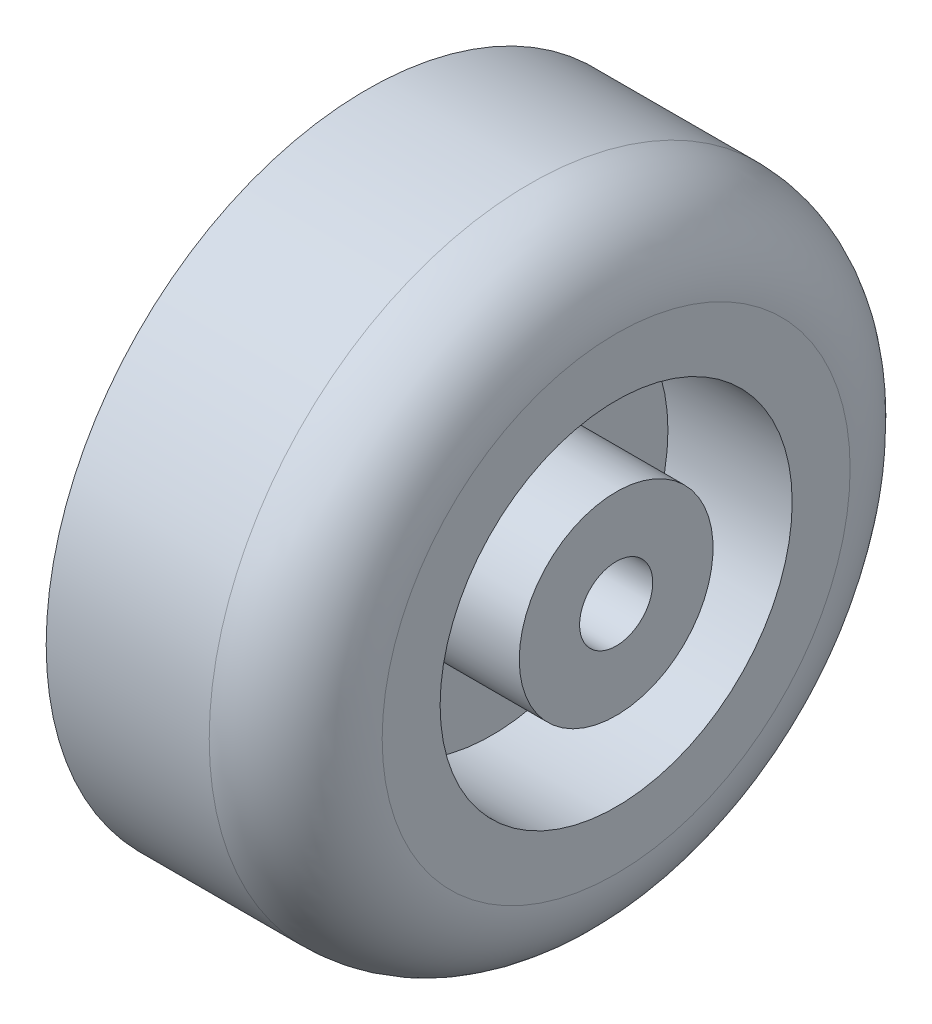
ISO-10303-21;
HEADER;
FILE_DESCRIPTION(('STEP AP214'),'2;1');
FILE_NAME('part.step','',(''),(''),'','','');
FILE_SCHEMA(('AUTOMOTIVE_DESIGN { 1 0 10303 214 1 1 1 1 }'));
ENDSEC;
DATA;
#1=APPLICATION_CONTEXT('core data for automotive mechanical design processes');
#2=APPLICATION_PROTOCOL_DEFINITION('international standard','automotive_design',2000,#1);
#3=PRODUCT_CONTEXT('',#1,'mechanical');
#4=PRODUCT('Part','Part','',(#3));
#5=PRODUCT_RELATED_PRODUCT_CATEGORY('part','',(#4));
#6=PRODUCT_DEFINITION_FORMATION('','',#4);
#7=PRODUCT_DEFINITION_CONTEXT('part definition',#1,'design');
#8=PRODUCT_DEFINITION('design','',#6,#7);
#9=PRODUCT_DEFINITION_SHAPE('','',#8);
#10=(LENGTH_UNIT() NAMED_UNIT(*) SI_UNIT(.MILLI.,.METRE.));
#11=(NAMED_UNIT(*) PLANE_ANGLE_UNIT() SI_UNIT($,.RADIAN.));
#12=(NAMED_UNIT(*) SI_UNIT($,.STERADIAN.) SOLID_ANGLE_UNIT());
#13=UNCERTAINTY_MEASURE_WITH_UNIT(LENGTH_MEASURE(1.E-05),#10,'distance_accuracy_value','');
#14=(GEOMETRIC_REPRESENTATION_CONTEXT(3) GLOBAL_UNCERTAINTY_ASSIGNED_CONTEXT((#13)) GLOBAL_UNIT_ASSIGNED_CONTEXT((#10,
#11,#12)) REPRESENTATION_CONTEXT('',''));
#15=CARTESIAN_POINT('',(0.,0.,0.));
#16=DIRECTION('',(0.,0.,1.));
#17=DIRECTION('',(1.,0.,0.));
#18=AXIS2_PLACEMENT_3D('',#15,#16,#17);
#19=CARTESIAN_POINT('',(0.,0.,0.));
#20=DIRECTION('',(-1.,0.,0.));
#21=DIRECTION('',(0.,0.,1.));
#22=AXIS2_PLACEMENT_3D('',#19,#20,#21);
#23=CYLINDRICAL_SURFACE('',#22,38.0758883852433);
#24=CARTESIAN_POINT('',(0.,0.,0.));
#25=DIRECTION('',(-1.,0.,0.));
#26=DIRECTION('',(0.,0.,1.));
#27=AXIS2_PLACEMENT_3D('',#24,#25,#26);
#28=CIRCLE('',#27,38.0758883852433);
#29=CARTESIAN_POINT('',(0.,0.,38.0758883852433));
#30=VERTEX_POINT('',#29);
#31=EDGE_CURVE('E54',#30,#30,#28,.T.);
#32=ORIENTED_EDGE('',*,*,#31,.T.);
#33=EDGE_LOOP('',(#32));
#34=FACE_BOUND('',#33,.T.);
#35=CARTESIAN_POINT('',(259.658864609172,0.,0.));
#36=DIRECTION('',(-1.,0.,0.));
#37=DIRECTION('',(0.,0.,1.));
#38=AXIS2_PLACEMENT_3D('',#35,#36,#37);
#39=CIRCLE('',#38,38.0758883852433);
#40=CARTESIAN_POINT('',(259.658864609172,0.,38.0758883852433));
#41=VERTEX_POINT('',#40);
#42=EDGE_CURVE('E81',#41,#41,#39,.T.);
#43=ORIENTED_EDGE('',*,*,#42,.F.);
#44=EDGE_LOOP('',(#43));
#45=FACE_BOUND('',#44,.T.);
#46=ADVANCED_FACE('F41',(#34,#45),#23,.F.);
#47=CARTESIAN_POINT('',(0.,38.0758883852433,0.));
#48=DIRECTION('',(-1.,0.,0.));
#49=DIRECTION('',(0.,0.,1.));
#50=AXIS2_PLACEMENT_3D('',#47,#48,#49);
#51=PLANE('',#50);
#52=CARTESIAN_POINT('',(0.,0.,0.));
#53=DIRECTION('',(-1.,0.,0.));
#54=DIRECTION('',(0.,0.,1.));
#55=AXIS2_PLACEMENT_3D('',#52,#53,#54);
#56=CIRCLE('',#55,333.491187988827);
#57=CARTESIAN_POINT('',(0.,0.,333.491187988827));
#58=VERTEX_POINT('',#57);
#59=EDGE_CURVE('E59',#58,#58,#56,.T.);
#60=ORIENTED_EDGE('',*,*,#59,.T.);
#61=EDGE_LOOP('',(#60));
#62=FACE_BOUND('',#61,.T.);
#63=ORIENTED_EDGE('',*,*,#31,.F.);
#64=EDGE_LOOP('',(#63));
#65=FACE_BOUND('',#64,.T.);
#66=ADVANCED_FACE('F90',(#62,#65),#51,.T.);
#67=CARTESIAN_POINT('',(0.,0.,0.));
#68=DIRECTION('',(-1.,0.,0.));
#69=DIRECTION('',(0.,0.,1.));
#70=AXIS2_PLACEMENT_3D('',#67,#68,#69);
#71=CYLINDRICAL_SURFACE('',#70,333.491187988827);
#72=CARTESIAN_POINT('',(169.658864609172,0.,0.));
#73=DIRECTION('',(1.,0.,0.));
#74=DIRECTION('',(0.,0.,-1.));
#75=AXIS2_PLACEMENT_3D('',#72,#73,#74);
#76=CIRCLE('',#75,333.491187988827);
#77=CARTESIAN_POINT('',(169.658864609172,0.,-333.491187988827));
#78=VERTEX_POINT('',#77);
#79=EDGE_CURVE('E49',#78,#78,#76,.F.);
#80=ORIENTED_EDGE('',*,*,#79,.T.);
#81=EDGE_LOOP('',(#80));
#82=FACE_BOUND('',#81,.T.);
#83=ORIENTED_EDGE('',*,*,#59,.F.);
#84=EDGE_LOOP('',(#83));
#85=FACE_BOUND('',#84,.T.);
#86=ADVANCED_FACE('F95',(#82,#85),#71,.T.);
#87=CARTESIAN_POINT('',(259.658864609172,333.491187988827,0.));
#88=DIRECTION('',(1.,0.,0.));
#89=DIRECTION('',(0.,0.,-1.));
#90=AXIS2_PLACEMENT_3D('',#87,#88,#89);
#91=PLANE('',#90);
#92=CARTESIAN_POINT('',(259.658864609172,0.,0.));
#93=DIRECTION('',(1.,0.,0.));
#94=DIRECTION('',(0.,0.,-1.));
#95=AXIS2_PLACEMENT_3D('',#92,#93,#94);
#96=CIRCLE('',#95,243.491187988827);
#97=CARTESIAN_POINT('',(259.658864609172,0.,-243.491187988827));
#98=VERTEX_POINT('',#97);
#99=EDGE_CURVE('E10',#98,#98,#96,.T.);
#100=ORIENTED_EDGE('',*,*,#99,.T.);
#101=EDGE_LOOP('',(#100));
#102=FACE_BOUND('',#101,.T.);
#103=CARTESIAN_POINT('',(259.658864609172,0.,0.));
#104=DIRECTION('',(-1.,0.,0.));
#105=DIRECTION('',(0.,0.,1.));
#106=AXIS2_PLACEMENT_3D('',#103,#104,#105);
#107=CIRCLE('',#106,183.190027572167);
#108=CARTESIAN_POINT('',(259.658864609172,0.,183.190027572167));
#109=VERTEX_POINT('',#108);
#110=EDGE_CURVE('E65',#109,#109,#107,.T.);
#111=ORIENTED_EDGE('',*,*,#110,.T.);
#112=EDGE_LOOP('',(#111));
#113=FACE_BOUND('',#112,.T.);
#114=ADVANCED_FACE('F101',(#102,#113),#91,.T.);
#115=CARTESIAN_POINT('',(0.,0.,0.));
#116=DIRECTION('',(-1.,0.,0.));
#117=DIRECTION('',(0.,0.,1.));
#118=AXIS2_PLACEMENT_3D('',#115,#116,#117);
#119=CYLINDRICAL_SURFACE('',#118,183.190027572167);
#120=CARTESIAN_POINT('',(130.366818781308,0.,0.));
#121=DIRECTION('',(-1.,0.,0.));
#122=DIRECTION('',(0.,0.,1.));
#123=AXIS2_PLACEMENT_3D('',#120,#121,#122);
#124=CIRCLE('',#123,183.190027572166);
#125=CARTESIAN_POINT('',(130.366818781308,0.,183.190027572166));
#126=VERTEX_POINT('',#125);
#127=EDGE_CURVE('E69',#126,#126,#124,.T.);
#128=ORIENTED_EDGE('',*,*,#127,.T.);
#129=EDGE_LOOP('',(#128));
#130=FACE_BOUND('',#129,.T.);
#131=ORIENTED_EDGE('',*,*,#110,.F.);
#132=EDGE_LOOP('',(#131));
#133=FACE_BOUND('',#132,.T.);
#134=ADVANCED_FACE('F104',(#130,#133),#119,.F.);
#135=CARTESIAN_POINT('',(130.366818781308,183.190027572166,0.));
#136=DIRECTION('',(1.,0.,0.));
#137=DIRECTION('',(0.,0.,-1.));
#138=AXIS2_PLACEMENT_3D('',#135,#136,#137);
#139=PLANE('',#138);
#140=CARTESIAN_POINT('',(130.366818781308,0.,0.));
#141=DIRECTION('',(-1.,0.,0.));
#142=DIRECTION('',(0.,0.,1.));
#143=AXIS2_PLACEMENT_3D('',#140,#141,#142);
#144=CIRCLE('',#143,100.842554237829);
#145=CARTESIAN_POINT('',(130.366818781308,0.,100.842554237829));
#146=VERTEX_POINT('',#145);
#147=EDGE_CURVE('E73',#146,#146,#144,.T.);
#148=ORIENTED_EDGE('',*,*,#147,.T.);
#149=EDGE_LOOP('',(#148));
#150=FACE_BOUND('',#149,.T.);
#151=ORIENTED_EDGE('',*,*,#127,.F.);
#152=EDGE_LOOP('',(#151));
#153=FACE_BOUND('',#152,.T.);
#154=ADVANCED_FACE('F107',(#150,#153),#139,.T.);
#155=CARTESIAN_POINT('',(0.,0.,0.));
#156=DIRECTION('',(-1.,0.,0.));
#157=DIRECTION('',(0.,0.,1.));
#158=AXIS2_PLACEMENT_3D('',#155,#156,#157);
#159=CYLINDRICAL_SURFACE('',#158,100.842554237829);
#160=CARTESIAN_POINT('',(259.658864609172,0.,0.));
#161=DIRECTION('',(-1.,0.,0.));
#162=DIRECTION('',(0.,0.,1.));
#163=AXIS2_PLACEMENT_3D('',#160,#161,#162);
#164=CIRCLE('',#163,100.842554237829);
#165=CARTESIAN_POINT('',(259.658864609172,0.,100.842554237829));
#166=VERTEX_POINT('',#165);
#167=EDGE_CURVE('E77',#166,#166,#164,.T.);
#168=ORIENTED_EDGE('',*,*,#167,.T.);
#169=EDGE_LOOP('',(#168));
#170=FACE_BOUND('',#169,.T.);
#171=ORIENTED_EDGE('',*,*,#147,.F.);
#172=EDGE_LOOP('',(#171));
#173=FACE_BOUND('',#172,.T.);
#174=ADVANCED_FACE('F111',(#170,#173),#159,.T.);
#175=CARTESIAN_POINT('',(259.658864609172,100.842554237829,0.));
#176=DIRECTION('',(1.,0.,0.));
#177=DIRECTION('',(0.,0.,-1.));
#178=AXIS2_PLACEMENT_3D('',#175,#176,#177);
#179=PLANE('',#178);
#180=ORIENTED_EDGE('',*,*,#42,.T.);
#181=EDGE_LOOP('',(#180));
#182=FACE_BOUND('',#181,.T.);
#183=ORIENTED_EDGE('',*,*,#167,.F.);
#184=EDGE_LOOP('',(#183));
#185=FACE_BOUND('',#184,.T.);
#186=ADVANCED_FACE('F86',(#182,#185),#179,.T.);
#187=CARTESIAN_POINT('',(169.658864609172,0.,0.));
#188=DIRECTION('',(1.,0.,0.));
#189=DIRECTION('',(0.,0.,-1.));
#190=AXIS2_PLACEMENT_3D('',#187,#188,#189);
#191=TOROIDAL_SURFACE('',#190,243.491187988827,90.);
#192=ORIENTED_EDGE('',*,*,#99,.F.);
#193=EDGE_LOOP('',(#192));
#194=FACE_BOUND('',#193,.T.);
#195=ORIENTED_EDGE('',*,*,#79,.F.);
#196=EDGE_LOOP('',(#195));
#197=FACE_BOUND('',#196,.T.);
#198=ADVANCED_FACE('F43',(#194,#197),#191,.T.);
#199=CLOSED_SHELL('',(#46,#66,#86,#114,#134,#154,#174,#186,#198));
#200=MANIFOLD_SOLID_BREP('B2',#199);
#201=ADVANCED_BREP_SHAPE_REPRESENTATION('',(#18,#200),#14);
#202=SHAPE_DEFINITION_REPRESENTATION(#9,#201);
ENDSEC;
END-ISO-10303-21;
